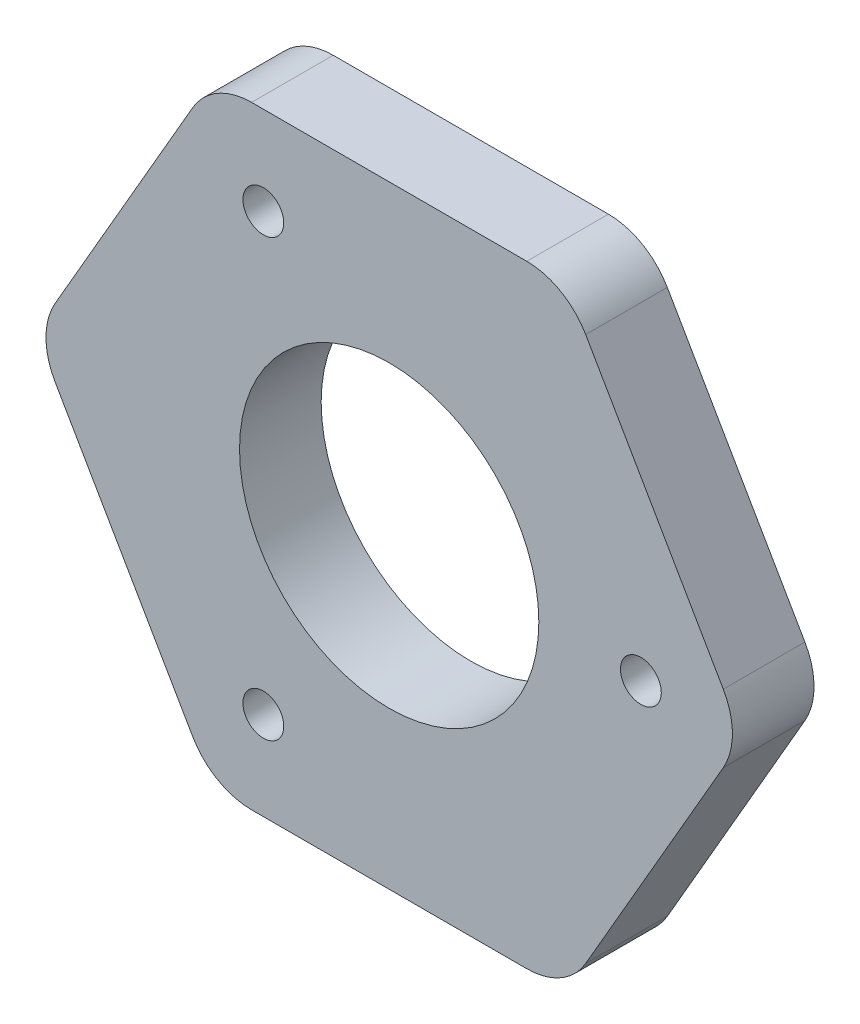
ISO-10303-21;
HEADER;
FILE_DESCRIPTION(('STEP AP214'),'2;1');
FILE_NAME('part.step','',(''),(''),'','','');
FILE_SCHEMA(('AUTOMOTIVE_DESIGN { 1 0 10303 214 1 1 1 1 }'));
ENDSEC;
DATA;
#1=APPLICATION_CONTEXT('core data for automotive mechanical design processes');
#2=APPLICATION_PROTOCOL_DEFINITION('international standard','automotive_design',2000,#1);
#3=PRODUCT_CONTEXT('',#1,'mechanical');
#4=PRODUCT('Part','Part','',(#3));
#5=PRODUCT_RELATED_PRODUCT_CATEGORY('part','',(#4));
#6=PRODUCT_DEFINITION_FORMATION('','',#4);
#7=PRODUCT_DEFINITION_CONTEXT('part definition',#1,'design');
#8=PRODUCT_DEFINITION('design','',#6,#7);
#9=PRODUCT_DEFINITION_SHAPE('','',#8);
#10=(LENGTH_UNIT() NAMED_UNIT(*) SI_UNIT(.MILLI.,.METRE.));
#11=(NAMED_UNIT(*) PLANE_ANGLE_UNIT() SI_UNIT($,.RADIAN.));
#12=(NAMED_UNIT(*) SI_UNIT($,.STERADIAN.) SOLID_ANGLE_UNIT());
#13=UNCERTAINTY_MEASURE_WITH_UNIT(LENGTH_MEASURE(1.E-05),#10,'distance_accuracy_value','');
#14=(GEOMETRIC_REPRESENTATION_CONTEXT(3) GLOBAL_UNCERTAINTY_ASSIGNED_CONTEXT((#13)) GLOBAL_UNIT_ASSIGNED_CONTEXT((#10,
#11,#12)) REPRESENTATION_CONTEXT('',''));
#15=CARTESIAN_POINT('',(0.,0.,0.));
#16=DIRECTION('',(0.,0.,1.));
#17=DIRECTION('',(1.,0.,0.));
#18=AXIS2_PLACEMENT_3D('',#15,#16,#17);
#19=CARTESIAN_POINT('',(-36.8744731332655,51.2733395015116,6.));
#20=DIRECTION('',(0.,0.,1.));
#21=DIRECTION('',(1.,0.,0.));
#22=AXIS2_PLACEMENT_3D('',#19,#20,#21);
#23=PLANE('',#22);
#24=CARTESIAN_POINT('',(-46.9877217873109,68.7899999999793,6.));
#25=DIRECTION('',(0.,0.,1.));
#26=DIRECTION('',(1.,0.,0.));
#27=AXIS2_PLACEMENT_3D('',#24,#25,#26);
#28=CIRCLE('',#27,11.0000000000365);
#29=CARTESIAN_POINT('',(-35.9877217872744,68.7899999999793,6.));
#30=VERTEX_POINT('',#29);
#31=EDGE_CURVE('E298',#30,#30,#28,.T.);
#32=ORIENTED_EDGE('',*,*,#31,.F.);
#33=EDGE_LOOP('',(#32));
#34=FACE_BOUND('',#33,.T.);
#35=CARTESIAN_POINT('',(-56.2377217873357,84.8114699699769,6.));
#36=DIRECTION('',(0.,0.,1.));
#37=DIRECTION('',(1.,0.,0.));
#38=AXIS2_PLACEMENT_3D('',#35,#36,#37);
#39=CIRCLE('',#38,1.50000000006488);
#40=CARTESIAN_POINT('',(-54.7377217872708,84.8114699699769,6.));
#41=VERTEX_POINT('',#40);
#42=EDGE_CURVE('E165',#41,#41,#39,.T.);
#43=ORIENTED_EDGE('',*,*,#42,.F.);
#44=EDGE_LOOP('',(#43));
#45=FACE_BOUND('',#44,.T.);
#46=CARTESIAN_POINT('',(-36.8744731332655,51.2733395015116,6.));
#47=DIRECTION('',(0.,0.,1.));
#48=DIRECTION('',(1.,0.,0.));
#49=AXIS2_PLACEMENT_3D('',#46,#47,#48);
#50=CIRCLE('',#49,4.99999999999962);
#51=CARTESIAN_POINT('',(-36.8744731332663,46.2733395015119,6.));
#52=VERTEX_POINT('',#51);
#53=CARTESIAN_POINT('',(-32.5443461143437,48.773339501512,6.));
#54=VERTEX_POINT('',#53);
#55=EDGE_CURVE('E184',#52,#54,#50,.T.);
#56=ORIENTED_EDGE('',*,*,#55,.T.);
#57=DIRECTION('',(0.50000000000004,0.866025403784415,0.));
#58=VECTOR('',#57,1.);
#59=CARTESIAN_POINT('',(-32.5443461143437,48.773339501512,6.));
#60=LINE('',#59,#58);
#61=CARTESIAN_POINT('',(-22.4310974602911,66.2899999999067,6.));
#62=VERTEX_POINT('',#61);
#63=EDGE_CURVE('E112',#54,#62,#60,.T.);
#64=ORIENTED_EDGE('',*,*,#63,.T.);
#65=CARTESIAN_POINT('',(-26.7612244792132,68.7899999999069,6.));
#66=DIRECTION('',(0.,0.,1.));
#67=DIRECTION('',(1.,0.,0.));
#68=AXIS2_PLACEMENT_3D('',#65,#66,#67);
#69=CIRCLE('',#68,5.00000000000006);
#70=CARTESIAN_POINT('',(-22.4310974602905,71.2899999999062,6.));
#71=VERTEX_POINT('',#70);
#72=EDGE_CURVE('E211',#62,#71,#69,.T.);
#73=ORIENTED_EDGE('',*,*,#72,.T.);
#74=DIRECTION('',(-0.499999999999852,0.866025403784524,0.));
#75=VECTOR('',#74,1.);
#76=CARTESIAN_POINT('',(-22.4310974602905,71.2899999999062,6.));
#77=LINE('',#76,#75);
#78=CARTESIAN_POINT('',(-32.5443461143395,88.806660498303,6.));
#79=VERTEX_POINT('',#78);
#80=EDGE_CURVE('E230',#71,#79,#77,.T.);
#81=ORIENTED_EDGE('',*,*,#80,.T.);
#82=CARTESIAN_POINT('',(-36.8744731332622,86.3066604983037,6.));
#83=DIRECTION('',(0.,0.,1.));
#84=DIRECTION('',(1.,0.,0.));
#85=AXIS2_PLACEMENT_3D('',#82,#83,#84);
#86=CIRCLE('',#85,5.0000000000001);
#87=CARTESIAN_POINT('',(-36.8744731332625,91.3066604983035,6.));
#88=VERTEX_POINT('',#87);
#89=EDGE_CURVE('E227',#79,#88,#86,.T.);
#90=ORIENTED_EDGE('',*,*,#89,.T.);
#91=DIRECTION('',(-1.,0.,0.));
#92=VECTOR('',#91,1.);
#93=CARTESIAN_POINT('',(-36.8744731332625,91.3066604983035,6.));
#94=LINE('',#93,#92);
#95=CARTESIAN_POINT('',(-57.100970441366,91.3066604983026,6.));
#96=VERTEX_POINT('',#95);
#97=EDGE_CURVE('E229',#88,#96,#94,.T.);
#98=ORIENTED_EDGE('',*,*,#97,.T.);
#99=CARTESIAN_POINT('',(-57.1009704413657,86.3066604983025,6.));
#100=DIRECTION('',(0.,0.,1.));
#101=DIRECTION('',(1.,0.,0.));
#102=AXIS2_PLACEMENT_3D('',#99,#100,#101);
#103=CIRCLE('',#102,5.00000000000006);
#104=CARTESIAN_POINT('',(-61.4310974602877,88.8066604983031,6.));
#105=VERTEX_POINT('',#104);
#106=EDGE_CURVE('E232',#96,#105,#103,.T.);
#107=ORIENTED_EDGE('',*,*,#106,.T.);
#108=DIRECTION('',(-0.500000000000112,-0.866025403784374,0.));
#109=VECTOR('',#108,1.);
#110=CARTESIAN_POINT('',(-61.4310974602877,88.8066604983031,6.));
#111=LINE('',#110,#109);
#112=CARTESIAN_POINT('',(-71.544346114342,71.2899999999094,6.));
#113=VERTEX_POINT('',#112);
#114=EDGE_CURVE('E238',#105,#113,#111,.T.);
#115=ORIENTED_EDGE('',*,*,#114,.T.);
#116=CARTESIAN_POINT('',(-67.2142190954198,68.7899999999087,6.));
#117=DIRECTION('',(0.,0.,1.));
#118=DIRECTION('',(1.,0.,0.));
#119=AXIS2_PLACEMENT_3D('',#116,#117,#118);
#120=CIRCLE('',#119,5.00000000000031);
#121=CARTESIAN_POINT('',(-71.5443461143428,66.2899999999088,6.));
#122=VERTEX_POINT('',#121);
#123=EDGE_CURVE('E143',#113,#122,#120,.T.);
#124=ORIENTED_EDGE('',*,*,#123,.T.);
#125=DIRECTION('',(0.499999999999943,-0.866025403784471,0.));
#126=VECTOR('',#125,1.);
#127=CARTESIAN_POINT('',(-71.5443461143428,66.2899999999088,6.));
#128=LINE('',#127,#126);
#129=CARTESIAN_POINT('',(-61.4310974602924,48.7733395015127,6.));
#130=VERTEX_POINT('',#129);
#131=EDGE_CURVE('E137',#122,#130,#128,.T.);
#132=ORIENTED_EDGE('',*,*,#131,.T.);
#133=CARTESIAN_POINT('',(-57.1009704413698,51.2733395015125,6.));
#134=DIRECTION('',(0.,0.,1.));
#135=DIRECTION('',(1.,0.,0.));
#136=AXIS2_PLACEMENT_3D('',#133,#134,#135);
#137=CIRCLE('',#136,5.0000000000003);
#138=CARTESIAN_POINT('',(-57.1009704413698,46.2733395015119,6.));
#139=VERTEX_POINT('',#138);
#140=EDGE_CURVE('E141',#130,#139,#137,.T.);
#141=ORIENTED_EDGE('',*,*,#140,.T.);
#142=DIRECTION('',(1.,0.,0.));
#143=VECTOR('',#142,1.);
#144=CARTESIAN_POINT('',(-57.1009704413698,46.2733395015119,6.));
#145=LINE('',#144,#143);
#146=EDGE_CURVE('E57',#139,#52,#145,.T.);
#147=ORIENTED_EDGE('',*,*,#146,.T.);
#148=EDGE_LOOP('',(#56,#64,#73,#81,#90,#98,#107,#115,#124,#132,#141,#147));
#149=FACE_BOUND('',#148,.T.);
#150=CARTESIAN_POINT('',(-28.4877217873253,68.7899999999829,6.));
#151=DIRECTION('',(0.,0.,1.));
#152=DIRECTION('',(1.,0.,0.));
#153=AXIS2_PLACEMENT_3D('',#150,#151,#152);
#154=CIRCLE('',#153,1.50000000004959);
#155=CARTESIAN_POINT('',(-26.9877217872757,68.7899999999829,6.));
#156=VERTEX_POINT('',#155);
#157=EDGE_CURVE('E304',#156,#156,#154,.T.);
#158=ORIENTED_EDGE('',*,*,#157,.F.);
#159=EDGE_LOOP('',(#158));
#160=FACE_BOUND('',#159,.T.);
#161=CARTESIAN_POINT('',(-56.237721787315,52.7685300299527,6.));
#162=DIRECTION('',(0.,0.,1.));
#163=DIRECTION('',(1.,0.,0.));
#164=AXIS2_PLACEMENT_3D('',#161,#162,#163);
#165=CIRCLE('',#164,1.50000000004489);
#166=CARTESIAN_POINT('',(-54.7377217872701,52.7685300299527,6.));
#167=VERTEX_POINT('',#166);
#168=EDGE_CURVE('E289',#167,#167,#165,.T.);
#169=ORIENTED_EDGE('',*,*,#168,.F.);
#170=EDGE_LOOP('',(#169));
#171=FACE_BOUND('',#170,.T.);
#172=ADVANCED_FACE('F40',(#34,#45,#149,#160,#171),#23,.T.);
#173=CARTESIAN_POINT('',(-36.8744731332655,51.2733395015116,0.));
#174=DIRECTION('',(0.,0.,1.));
#175=DIRECTION('',(1.,0.,0.));
#176=AXIS2_PLACEMENT_3D('',#173,#174,#175);
#177=PLANE('',#176);
#178=CARTESIAN_POINT('',(-36.8744731332655,51.2733395015116,0.));
#179=DIRECTION('',(0.,0.,1.));
#180=DIRECTION('',(1.,0.,0.));
#181=AXIS2_PLACEMENT_3D('',#178,#179,#180);
#182=CIRCLE('',#181,4.99999999999962);
#183=CARTESIAN_POINT('',(-36.8744731332663,46.2733395015119,0.));
#184=VERTEX_POINT('',#183);
#185=CARTESIAN_POINT('',(-32.5443461143437,48.773339501512,0.));
#186=VERTEX_POINT('',#185);
#187=EDGE_CURVE('E161',#184,#186,#182,.T.);
#188=ORIENTED_EDGE('',*,*,#187,.F.);
#189=DIRECTION('',(1.,0.,0.));
#190=VECTOR('',#189,1.);
#191=CARTESIAN_POINT('',(-57.1009704413698,46.2733395015119,0.));
#192=LINE('',#191,#190);
#193=CARTESIAN_POINT('',(-57.1009704413698,46.2733395015119,0.));
#194=VERTEX_POINT('',#193);
#195=EDGE_CURVE('E104',#194,#184,#192,.T.);
#196=ORIENTED_EDGE('',*,*,#195,.F.);
#197=CARTESIAN_POINT('',(-57.1009704413698,51.2733395015125,0.));
#198=DIRECTION('',(0.,0.,1.));
#199=DIRECTION('',(1.,0.,0.));
#200=AXIS2_PLACEMENT_3D('',#197,#198,#199);
#201=CIRCLE('',#200,5.0000000000003);
#202=CARTESIAN_POINT('',(-61.4310974602924,48.7733395015127,0.));
#203=VERTEX_POINT('',#202);
#204=EDGE_CURVE('E98',#203,#194,#201,.T.);
#205=ORIENTED_EDGE('',*,*,#204,.F.);
#206=DIRECTION('',(0.499999999999943,-0.866025403784471,0.));
#207=VECTOR('',#206,1.);
#208=CARTESIAN_POINT('',(-71.5443461143428,66.2899999999088,0.));
#209=LINE('',#208,#207);
#210=CARTESIAN_POINT('',(-71.5443461143428,66.2899999999088,0.));
#211=VERTEX_POINT('',#210);
#212=EDGE_CURVE('E151',#211,#203,#209,.T.);
#213=ORIENTED_EDGE('',*,*,#212,.F.);
#214=CARTESIAN_POINT('',(-67.2142190954198,68.7899999999087,0.));
#215=DIRECTION('',(0.,0.,1.));
#216=DIRECTION('',(1.,0.,0.));
#217=AXIS2_PLACEMENT_3D('',#214,#215,#216);
#218=CIRCLE('',#217,5.00000000000031);
#219=CARTESIAN_POINT('',(-71.544346114342,71.2899999999094,0.));
#220=VERTEX_POINT('',#219);
#221=EDGE_CURVE('E179',#220,#211,#218,.T.);
#222=ORIENTED_EDGE('',*,*,#221,.F.);
#223=DIRECTION('',(-0.500000000000112,-0.866025403784374,0.));
#224=VECTOR('',#223,1.);
#225=CARTESIAN_POINT('',(-61.4310974602877,88.8066604983031,0.));
#226=LINE('',#225,#224);
#227=CARTESIAN_POINT('',(-61.4310974602877,88.8066604983031,0.));
#228=VERTEX_POINT('',#227);
#229=EDGE_CURVE('E177',#228,#220,#226,.T.);
#230=ORIENTED_EDGE('',*,*,#229,.F.);
#231=CARTESIAN_POINT('',(-57.1009704413657,86.3066604983025,0.));
#232=DIRECTION('',(0.,0.,1.));
#233=DIRECTION('',(1.,0.,0.));
#234=AXIS2_PLACEMENT_3D('',#231,#232,#233);
#235=CIRCLE('',#234,5.00000000000006);
#236=CARTESIAN_POINT('',(-57.100970441366,91.3066604983026,0.));
#237=VERTEX_POINT('',#236);
#238=EDGE_CURVE('E175',#237,#228,#235,.T.);
#239=ORIENTED_EDGE('',*,*,#238,.F.);
#240=DIRECTION('',(-1.,0.,0.));
#241=VECTOR('',#240,1.);
#242=CARTESIAN_POINT('',(-36.8744731332625,91.3066604983035,0.));
#243=LINE('',#242,#241);
#244=CARTESIAN_POINT('',(-36.8744731332625,91.3066604983035,0.));
#245=VERTEX_POINT('',#244);
#246=EDGE_CURVE('E173',#245,#237,#243,.T.);
#247=ORIENTED_EDGE('',*,*,#246,.F.);
#248=CARTESIAN_POINT('',(-36.8744731332622,86.3066604983037,0.));
#249=DIRECTION('',(0.,0.,1.));
#250=DIRECTION('',(1.,0.,0.));
#251=AXIS2_PLACEMENT_3D('',#248,#249,#250);
#252=CIRCLE('',#251,5.0000000000001);
#253=CARTESIAN_POINT('',(-32.5443461143395,88.806660498303,0.));
#254=VERTEX_POINT('',#253);
#255=EDGE_CURVE('E171',#254,#245,#252,.T.);
#256=ORIENTED_EDGE('',*,*,#255,.F.);
#257=DIRECTION('',(-0.499999999999852,0.866025403784524,0.));
#258=VECTOR('',#257,1.);
#259=CARTESIAN_POINT('',(-22.4310974602905,71.2899999999062,0.));
#260=LINE('',#259,#258);
#261=CARTESIAN_POINT('',(-22.4310974602905,71.2899999999062,0.));
#262=VERTEX_POINT('',#261);
#263=EDGE_CURVE('E169',#262,#254,#260,.T.);
#264=ORIENTED_EDGE('',*,*,#263,.F.);
#265=CARTESIAN_POINT('',(-26.7612244792132,68.7899999999069,0.));
#266=DIRECTION('',(0.,0.,1.));
#267=DIRECTION('',(1.,0.,0.));
#268=AXIS2_PLACEMENT_3D('',#265,#266,#267);
#269=CIRCLE('',#268,5.00000000000006);
#270=CARTESIAN_POINT('',(-22.4310974602911,66.2899999999067,0.));
#271=VERTEX_POINT('',#270);
#272=EDGE_CURVE('E167',#271,#262,#269,.T.);
#273=ORIENTED_EDGE('',*,*,#272,.F.);
#274=DIRECTION('',(0.50000000000004,0.866025403784415,0.));
#275=VECTOR('',#274,1.);
#276=CARTESIAN_POINT('',(-32.5443461143437,48.773339501512,0.));
#277=LINE('',#276,#275);
#278=EDGE_CURVE('E164',#186,#271,#277,.T.);
#279=ORIENTED_EDGE('',*,*,#278,.F.);
#280=EDGE_LOOP('',(#188,#196,#205,#213,#222,#230,#239,#247,#256,#264,#273,#279));
#281=FACE_BOUND('',#280,.T.);
#282=CARTESIAN_POINT('',(-56.2377217873357,84.8114699699769,0.));
#283=DIRECTION('',(0.,0.,1.));
#284=DIRECTION('',(1.,0.,0.));
#285=AXIS2_PLACEMENT_3D('',#282,#283,#284);
#286=CIRCLE('',#285,1.50000000006488);
#287=CARTESIAN_POINT('',(-54.7377217872708,84.8114699699769,0.));
#288=VERTEX_POINT('',#287);
#289=EDGE_CURVE('E307',#288,#288,#286,.T.);
#290=ORIENTED_EDGE('',*,*,#289,.T.);
#291=EDGE_LOOP('',(#290));
#292=FACE_BOUND('',#291,.T.);
#293=CARTESIAN_POINT('',(-28.4877217873253,68.7899999999829,0.));
#294=DIRECTION('',(0.,0.,1.));
#295=DIRECTION('',(1.,0.,0.));
#296=AXIS2_PLACEMENT_3D('',#293,#294,#295);
#297=CIRCLE('',#296,1.50000000004959);
#298=CARTESIAN_POINT('',(-26.9877217872757,68.7899999999829,0.));
#299=VERTEX_POINT('',#298);
#300=EDGE_CURVE('E301',#299,#299,#297,.T.);
#301=ORIENTED_EDGE('',*,*,#300,.T.);
#302=EDGE_LOOP('',(#301));
#303=FACE_BOUND('',#302,.T.);
#304=CARTESIAN_POINT('',(-46.9877217873109,68.7899999999793,0.));
#305=DIRECTION('',(0.,0.,1.));
#306=DIRECTION('',(1.,0.,0.));
#307=AXIS2_PLACEMENT_3D('',#304,#305,#306);
#308=CIRCLE('',#307,11.0000000000365);
#309=CARTESIAN_POINT('',(-35.9877217872744,68.7899999999793,0.));
#310=VERTEX_POINT('',#309);
#311=EDGE_CURVE('E295',#310,#310,#308,.T.);
#312=ORIENTED_EDGE('',*,*,#311,.T.);
#313=EDGE_LOOP('',(#312));
#314=FACE_BOUND('',#313,.T.);
#315=CARTESIAN_POINT('',(-56.237721787315,52.7685300299527,0.));
#316=DIRECTION('',(0.,0.,1.));
#317=DIRECTION('',(1.,0.,0.));
#318=AXIS2_PLACEMENT_3D('',#315,#316,#317);
#319=CIRCLE('',#318,1.50000000004489);
#320=CARTESIAN_POINT('',(-54.7377217872701,52.7685300299527,0.));
#321=VERTEX_POINT('',#320);
#322=EDGE_CURVE('E292',#321,#321,#319,.T.);
#323=ORIENTED_EDGE('',*,*,#322,.T.);
#324=EDGE_LOOP('',(#323));
#325=FACE_BOUND('',#324,.T.);
#326=ADVANCED_FACE('F215',(#281,#292,#303,#314,#325),#177,.F.);
#327=CARTESIAN_POINT('',(-36.8744731332655,51.2733395015116,6.));
#328=DIRECTION('',(0.,0.,-1.));
#329=DIRECTION('',(-1.,0.,0.));
#330=AXIS2_PLACEMENT_3D('',#327,#328,#329);
#331=CYLINDRICAL_SURFACE('',#330,4.99999999999962);
#332=ORIENTED_EDGE('',*,*,#187,.T.);
#333=DIRECTION('',(0.,0.,-1.));
#334=VECTOR('',#333,1.);
#335=CARTESIAN_POINT('',(-32.5443461143437,48.773339501512,6.));
#336=LINE('',#335,#334);
#337=EDGE_CURVE('E11',#54,#186,#336,.T.);
#338=ORIENTED_EDGE('',*,*,#337,.F.);
#339=ORIENTED_EDGE('',*,*,#55,.F.);
#340=DIRECTION('',(0.,0.,-1.));
#341=VECTOR('',#340,1.);
#342=CARTESIAN_POINT('',(-36.8744731332663,46.2733395015119,6.));
#343=LINE('',#342,#341);
#344=EDGE_CURVE('E157',#52,#184,#343,.T.);
#345=ORIENTED_EDGE('',*,*,#344,.T.);
#346=EDGE_LOOP('',(#332,#338,#339,#345));
#347=FACE_BOUND('',#346,.T.);
#348=ADVANCED_FACE('F42',(#347),#331,.T.);
#349=CARTESIAN_POINT('',(-32.5443461143437,48.773339501512,6.));
#350=DIRECTION('',(-0.866025403784415,0.50000000000004,0.));
#351=DIRECTION('',(-0.50000000000004,-0.866025403784415,0.));
#352=AXIS2_PLACEMENT_3D('',#349,#350,#351);
#353=PLANE('',#352);
#354=ORIENTED_EDGE('',*,*,#278,.T.);
#355=DIRECTION('',(0.,0.,-1.));
#356=VECTOR('',#355,1.);
#357=CARTESIAN_POINT('',(-22.4310974602911,66.2899999999067,6.));
#358=LINE('',#357,#356);
#359=EDGE_CURVE('E49',#62,#271,#358,.T.);
#360=ORIENTED_EDGE('',*,*,#359,.F.);
#361=ORIENTED_EDGE('',*,*,#63,.F.);
#362=ORIENTED_EDGE('',*,*,#337,.T.);
#363=EDGE_LOOP('',(#354,#360,#361,#362));
#364=FACE_BOUND('',#363,.T.);
#365=ADVANCED_FACE('F427',(#364),#353,.F.);
#366=CARTESIAN_POINT('',(-26.7612244792132,68.7899999999069,6.));
#367=DIRECTION('',(0.,0.,-1.));
#368=DIRECTION('',(-1.,0.,0.));
#369=AXIS2_PLACEMENT_3D('',#366,#367,#368);
#370=CYLINDRICAL_SURFACE('',#369,5.00000000000006);
#371=ORIENTED_EDGE('',*,*,#272,.T.);
#372=DIRECTION('',(0.,0.,-1.));
#373=VECTOR('',#372,1.);
#374=CARTESIAN_POINT('',(-22.4310974602905,71.2899999999062,6.));
#375=LINE('',#374,#373);
#376=EDGE_CURVE('E203',#71,#262,#375,.T.);
#377=ORIENTED_EDGE('',*,*,#376,.F.);
#378=ORIENTED_EDGE('',*,*,#72,.F.);
#379=ORIENTED_EDGE('',*,*,#359,.T.);
#380=EDGE_LOOP('',(#371,#377,#378,#379));
#381=FACE_BOUND('',#380,.T.);
#382=ADVANCED_FACE('F209',(#381),#370,.T.);
#383=CARTESIAN_POINT('',(-22.4310974602905,71.2899999999062,6.));
#384=DIRECTION('',(-0.866025403784524,-0.499999999999851,0.));
#385=DIRECTION('',(0.499999999999852,-0.866025403784525,0.));
#386=AXIS2_PLACEMENT_3D('',#383,#384,#385);
#387=PLANE('',#386);
#388=ORIENTED_EDGE('',*,*,#263,.T.);
#389=DIRECTION('',(0.,0.,-1.));
#390=VECTOR('',#389,1.);
#391=CARTESIAN_POINT('',(-32.5443461143395,88.806660498303,6.));
#392=LINE('',#391,#390);
#393=EDGE_CURVE('E200',#79,#254,#392,.T.);
#394=ORIENTED_EDGE('',*,*,#393,.F.);
#395=ORIENTED_EDGE('',*,*,#80,.F.);
#396=ORIENTED_EDGE('',*,*,#376,.T.);
#397=EDGE_LOOP('',(#388,#394,#395,#396));
#398=FACE_BOUND('',#397,.T.);
#399=ADVANCED_FACE('F221',(#398),#387,.F.);
#400=CARTESIAN_POINT('',(-36.8744731332622,86.3066604983037,6.));
#401=DIRECTION('',(0.,0.,-1.));
#402=DIRECTION('',(-1.,0.,0.));
#403=AXIS2_PLACEMENT_3D('',#400,#401,#402);
#404=CYLINDRICAL_SURFACE('',#403,5.0000000000001);
#405=ORIENTED_EDGE('',*,*,#255,.T.);
#406=DIRECTION('',(0.,0.,-1.));
#407=VECTOR('',#406,1.);
#408=CARTESIAN_POINT('',(-36.8744731332625,91.3066604983035,6.));
#409=LINE('',#408,#407);
#410=EDGE_CURVE('E197',#88,#245,#409,.T.);
#411=ORIENTED_EDGE('',*,*,#410,.F.);
#412=ORIENTED_EDGE('',*,*,#89,.F.);
#413=ORIENTED_EDGE('',*,*,#393,.T.);
#414=EDGE_LOOP('',(#405,#411,#412,#413));
#415=FACE_BOUND('',#414,.T.);
#416=ADVANCED_FACE('F225',(#415),#404,.T.);
#417=CARTESIAN_POINT('',(-36.8744731332625,91.3066604983035,6.));
#418=DIRECTION('',(0.,-1.,0.));
#419=DIRECTION('',(1.,0.,0.));
#420=AXIS2_PLACEMENT_3D('',#417,#418,#419);
#421=PLANE('',#420);
#422=ORIENTED_EDGE('',*,*,#246,.T.);
#423=DIRECTION('',(0.,0.,-1.));
#424=VECTOR('',#423,1.);
#425=CARTESIAN_POINT('',(-57.100970441366,91.3066604983026,6.));
#426=LINE('',#425,#424);
#427=EDGE_CURVE('E194',#96,#237,#426,.T.);
#428=ORIENTED_EDGE('',*,*,#427,.F.);
#429=ORIENTED_EDGE('',*,*,#97,.F.);
#430=ORIENTED_EDGE('',*,*,#410,.T.);
#431=EDGE_LOOP('',(#422,#428,#429,#430));
#432=FACE_BOUND('',#431,.T.);
#433=ADVANCED_FACE('F388',(#432),#421,.F.);
#434=CARTESIAN_POINT('',(-57.1009704413657,86.3066604983025,6.));
#435=DIRECTION('',(0.,0.,-1.));
#436=DIRECTION('',(-1.,0.,0.));
#437=AXIS2_PLACEMENT_3D('',#434,#435,#436);
#438=CYLINDRICAL_SURFACE('',#437,5.00000000000006);
#439=ORIENTED_EDGE('',*,*,#238,.T.);
#440=DIRECTION('',(0.,0.,-1.));
#441=VECTOR('',#440,1.);
#442=CARTESIAN_POINT('',(-61.4310974602877,88.8066604983031,6.));
#443=LINE('',#442,#441);
#444=EDGE_CURVE('E191',#105,#228,#443,.T.);
#445=ORIENTED_EDGE('',*,*,#444,.F.);
#446=ORIENTED_EDGE('',*,*,#106,.F.);
#447=ORIENTED_EDGE('',*,*,#427,.T.);
#448=EDGE_LOOP('',(#439,#445,#446,#447));
#449=FACE_BOUND('',#448,.T.);
#450=ADVANCED_FACE('F378',(#449),#438,.T.);
#451=CARTESIAN_POINT('',(-61.4310974602877,88.8066604983031,6.));
#452=DIRECTION('',(0.866025403784374,-0.500000000000112,0.));
#453=DIRECTION('',(0.500000000000113,0.866025403784374,0.));
#454=AXIS2_PLACEMENT_3D('',#451,#452,#453);
#455=PLANE('',#454);
#456=ORIENTED_EDGE('',*,*,#229,.T.);
#457=DIRECTION('',(0.,0.,-1.));
#458=VECTOR('',#457,1.);
#459=CARTESIAN_POINT('',(-71.544346114342,71.2899999999094,6.));
#460=LINE('',#459,#458);
#461=EDGE_CURVE('E188',#113,#220,#460,.T.);
#462=ORIENTED_EDGE('',*,*,#461,.F.);
#463=ORIENTED_EDGE('',*,*,#114,.F.);
#464=ORIENTED_EDGE('',*,*,#444,.T.);
#465=EDGE_LOOP('',(#456,#462,#463,#464));
#466=FACE_BOUND('',#465,.T.);
#467=ADVANCED_FACE('F244',(#466),#455,.F.);
#468=CARTESIAN_POINT('',(-67.2142190954198,68.7899999999087,6.));
#469=DIRECTION('',(0.,0.,-1.));
#470=DIRECTION('',(-1.,0.,0.));
#471=AXIS2_PLACEMENT_3D('',#468,#469,#470);
#472=CYLINDRICAL_SURFACE('',#471,5.00000000000031);
#473=ORIENTED_EDGE('',*,*,#221,.T.);
#474=DIRECTION('',(0.,0.,-1.));
#475=VECTOR('',#474,1.);
#476=CARTESIAN_POINT('',(-71.5443461143428,66.2899999999088,6.));
#477=LINE('',#476,#475);
#478=EDGE_CURVE('E152',#122,#211,#477,.T.);
#479=ORIENTED_EDGE('',*,*,#478,.F.);
#480=ORIENTED_EDGE('',*,*,#123,.F.);
#481=ORIENTED_EDGE('',*,*,#461,.T.);
#482=EDGE_LOOP('',(#473,#479,#480,#481));
#483=FACE_BOUND('',#482,.T.);
#484=ADVANCED_FACE('F248',(#483),#472,.T.);
#485=CARTESIAN_POINT('',(-71.5443461143428,66.2899999999088,6.));
#486=DIRECTION('',(0.866025403784471,0.499999999999943,0.));
#487=DIRECTION('',(-0.499999999999943,0.866025403784471,0.));
#488=AXIS2_PLACEMENT_3D('',#485,#486,#487);
#489=PLANE('',#488);
#490=ORIENTED_EDGE('',*,*,#212,.T.);
#491=DIRECTION('',(0.,0.,-1.));
#492=VECTOR('',#491,1.);
#493=CARTESIAN_POINT('',(-61.4310974602924,48.7733395015127,6.));
#494=LINE('',#493,#492);
#495=EDGE_CURVE('E148',#130,#203,#494,.T.);
#496=ORIENTED_EDGE('',*,*,#495,.F.);
#497=ORIENTED_EDGE('',*,*,#131,.F.);
#498=ORIENTED_EDGE('',*,*,#478,.T.);
#499=EDGE_LOOP('',(#490,#496,#497,#498));
#500=FACE_BOUND('',#499,.T.);
#501=ADVANCED_FACE('F149',(#500),#489,.F.);
#502=CARTESIAN_POINT('',(-57.1009704413698,51.2733395015125,6.));
#503=DIRECTION('',(0.,0.,-1.));
#504=DIRECTION('',(-1.,0.,0.));
#505=AXIS2_PLACEMENT_3D('',#502,#503,#504);
#506=CYLINDRICAL_SURFACE('',#505,5.0000000000003);
#507=ORIENTED_EDGE('',*,*,#204,.T.);
#508=DIRECTION('',(0.,0.,-1.));
#509=VECTOR('',#508,1.);
#510=CARTESIAN_POINT('',(-57.1009704413698,46.2733395015119,6.));
#511=LINE('',#510,#509);
#512=EDGE_CURVE('E153',#139,#194,#511,.T.);
#513=ORIENTED_EDGE('',*,*,#512,.F.);
#514=ORIENTED_EDGE('',*,*,#140,.F.);
#515=ORIENTED_EDGE('',*,*,#495,.T.);
#516=EDGE_LOOP('',(#507,#513,#514,#515));
#517=FACE_BOUND('',#516,.T.);
#518=ADVANCED_FACE('F155',(#517),#506,.T.);
#519=CARTESIAN_POINT('',(-57.1009704413698,46.2733395015119,6.));
#520=DIRECTION('',(0.,1.,0.));
#521=DIRECTION('',(0.,0.,1.));
#522=AXIS2_PLACEMENT_3D('',#519,#520,#521);
#523=PLANE('',#522);
#524=ORIENTED_EDGE('',*,*,#195,.T.);
#525=ORIENTED_EDGE('',*,*,#344,.F.);
#526=ORIENTED_EDGE('',*,*,#146,.F.);
#527=ORIENTED_EDGE('',*,*,#512,.T.);
#528=EDGE_LOOP('',(#524,#525,#526,#527));
#529=FACE_BOUND('',#528,.T.);
#530=ADVANCED_FACE('F252',(#529),#523,.F.);
#531=CARTESIAN_POINT('',(-56.2377217873357,84.8114699699769,6.));
#532=DIRECTION('',(0.,0.,-1.));
#533=DIRECTION('',(-1.,0.,0.));
#534=AXIS2_PLACEMENT_3D('',#531,#532,#533);
#535=CYLINDRICAL_SURFACE('',#534,1.50000000006488);
#536=ORIENTED_EDGE('',*,*,#42,.T.);
#537=EDGE_LOOP('',(#536));
#538=FACE_BOUND('',#537,.T.);
#539=ORIENTED_EDGE('',*,*,#289,.F.);
#540=EDGE_LOOP('',(#539));
#541=FACE_BOUND('',#540,.T.);
#542=ADVANCED_FACE('F254',(#538,#541),#535,.F.);
#543=CARTESIAN_POINT('',(-28.4877217873253,68.7899999999829,6.));
#544=DIRECTION('',(0.,0.,-1.));
#545=DIRECTION('',(-1.,0.,0.));
#546=AXIS2_PLACEMENT_3D('',#543,#544,#545);
#547=CYLINDRICAL_SURFACE('',#546,1.50000000004959);
#548=ORIENTED_EDGE('',*,*,#157,.T.);
#549=EDGE_LOOP('',(#548));
#550=FACE_BOUND('',#549,.T.);
#551=ORIENTED_EDGE('',*,*,#300,.F.);
#552=EDGE_LOOP('',(#551));
#553=FACE_BOUND('',#552,.T.);
#554=ADVANCED_FACE('F260',(#550,#553),#547,.F.);
#555=CARTESIAN_POINT('',(-46.9877217873109,68.7899999999793,6.));
#556=DIRECTION('',(0.,0.,-1.));
#557=DIRECTION('',(-1.,0.,0.));
#558=AXIS2_PLACEMENT_3D('',#555,#556,#557);
#559=CYLINDRICAL_SURFACE('',#558,11.0000000000365);
#560=ORIENTED_EDGE('',*,*,#31,.T.);
#561=EDGE_LOOP('',(#560));
#562=FACE_BOUND('',#561,.T.);
#563=ORIENTED_EDGE('',*,*,#311,.F.);
#564=EDGE_LOOP('',(#563));
#565=FACE_BOUND('',#564,.T.);
#566=ADVANCED_FACE('F276',(#562,#565),#559,.F.);
#567=CARTESIAN_POINT('',(-56.237721787315,52.7685300299527,6.));
#568=DIRECTION('',(0.,0.,-1.));
#569=DIRECTION('',(-1.,0.,0.));
#570=AXIS2_PLACEMENT_3D('',#567,#568,#569);
#571=CYLINDRICAL_SURFACE('',#570,1.50000000004489);
#572=ORIENTED_EDGE('',*,*,#168,.T.);
#573=EDGE_LOOP('',(#572));
#574=FACE_BOUND('',#573,.T.);
#575=ORIENTED_EDGE('',*,*,#322,.F.);
#576=EDGE_LOOP('',(#575));
#577=FACE_BOUND('',#576,.T.);
#578=ADVANCED_FACE('F280',(#574,#577),#571,.F.);
#579=CLOSED_SHELL('',(#172,#326,#348,#365,#382,#399,#416,#433,#450,#467,#484,#501,#518,#530,
#542,#554,#566,#578));
#580=MANIFOLD_SOLID_BREP('B2',#579);
#581=ADVANCED_BREP_SHAPE_REPRESENTATION('',(#18,#580),#14);
#582=SHAPE_DEFINITION_REPRESENTATION(#9,#581);
ENDSEC;
END-ISO-10303-21;
